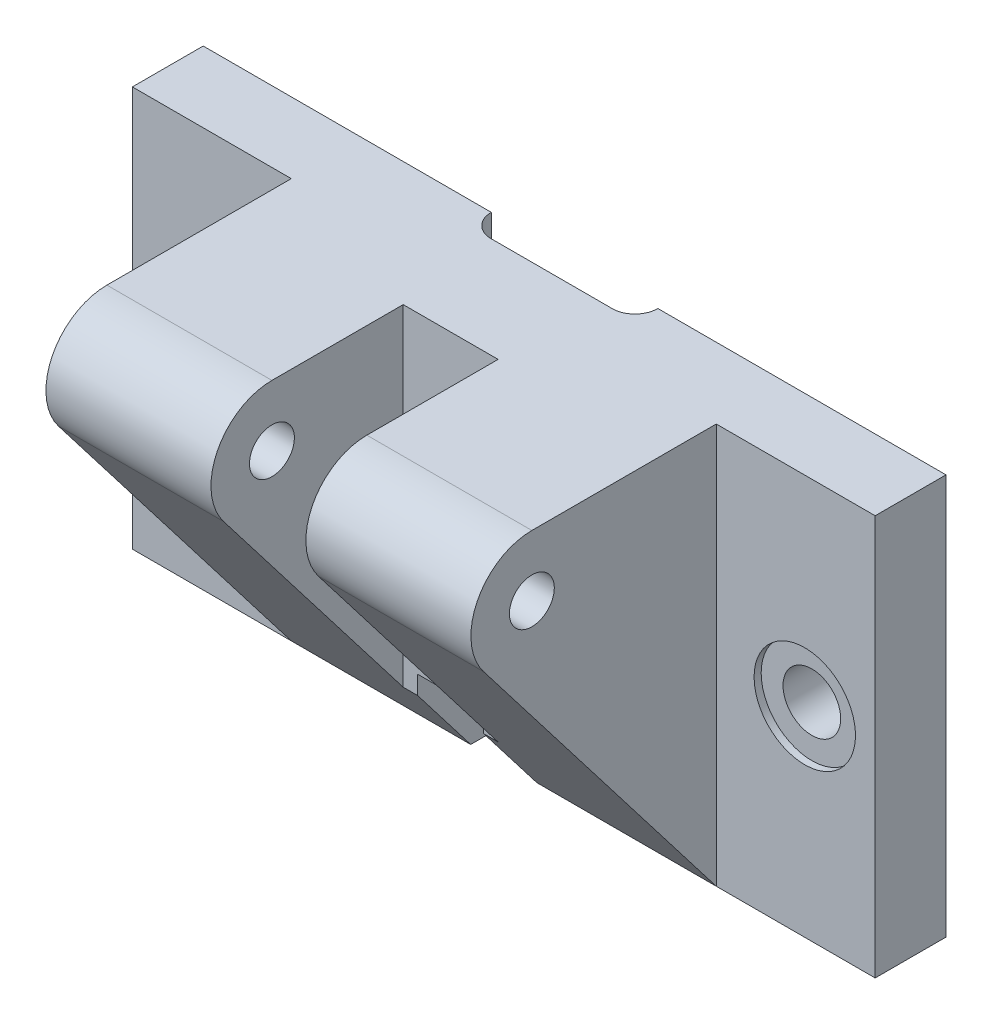
ISO-10303-21;
HEADER;
FILE_DESCRIPTION(('STEP AP214'),'2;1');
FILE_NAME('part.step','',(''),(''),'','','');
FILE_SCHEMA(('AUTOMOTIVE_DESIGN { 1 0 10303 214 1 1 1 1 }'));
ENDSEC;
DATA;
#1=APPLICATION_CONTEXT('core data for automotive mechanical design processes');
#2=APPLICATION_PROTOCOL_DEFINITION('international standard','automotive_design',2000,#1);
#3=PRODUCT_CONTEXT('',#1,'mechanical');
#4=PRODUCT('Part','Part','',(#3));
#5=PRODUCT_RELATED_PRODUCT_CATEGORY('part','',(#4));
#6=PRODUCT_DEFINITION_FORMATION('','',#4);
#7=PRODUCT_DEFINITION_CONTEXT('part definition',#1,'design');
#8=PRODUCT_DEFINITION('design','',#6,#7);
#9=PRODUCT_DEFINITION_SHAPE('','',#8);
#10=(LENGTH_UNIT() NAMED_UNIT(*) SI_UNIT(.MILLI.,.METRE.));
#11=(NAMED_UNIT(*) PLANE_ANGLE_UNIT() SI_UNIT($,.RADIAN.));
#12=(NAMED_UNIT(*) SI_UNIT($,.STERADIAN.) SOLID_ANGLE_UNIT());
#13=UNCERTAINTY_MEASURE_WITH_UNIT(LENGTH_MEASURE(1.E-05),#10,'distance_accuracy_value','');
#14=(GEOMETRIC_REPRESENTATION_CONTEXT(3) GLOBAL_UNCERTAINTY_ASSIGNED_CONTEXT((#13)) GLOBAL_UNIT_ASSIGNED_CONTEXT((#10,
#11,#12)) REPRESENTATION_CONTEXT('',''));
#15=CARTESIAN_POINT('',(0.,0.,0.));
#16=DIRECTION('',(0.,0.,1.));
#17=DIRECTION('',(1.,0.,0.));
#18=AXIS2_PLACEMENT_3D('',#15,#16,#17);
#19=CARTESIAN_POINT('',(60.,35.2757010099702,85.7035733266576));
#20=DIRECTION('',(0.,0.6100561092339,-0.792358216709081));
#21=DIRECTION('',(0.,0.792358216709081,0.6100561092339));
#22=AXIS2_PLACEMENT_3D('',#19,#20,#21);
#23=PLANE('',#22);
#24=DIRECTION('',(-1.,0.,0.));
#25=VECTOR('',#24,1.);
#26=CARTESIAN_POINT('',(60.,-30.5795413747676,35.));
#27=LINE('',#26,#25);
#28=CARTESIAN_POINT('',(13.4007728166381,-30.5795413747676,35.));
#29=VERTEX_POINT('',#28);
#30=CARTESIAN_POINT('',(9.33829474696551,-30.5795413747676,35.));
#31=VERTEX_POINT('',#30);
#32=EDGE_CURVE('E43',#29,#31,#27,.T.);
#33=ORIENTED_EDGE('',*,*,#32,.T.);
#34=DIRECTION('',(0.,-0.792358216709081,-0.6100561092339));
#35=VECTOR('',#34,1.);
#36=CARTESIAN_POINT('',(9.33829474696549,35.2757010099702,85.7035733266576));
#37=LINE('',#36,#35);
#38=CARTESIAN_POINT('',(9.33829474696551,-50.0619677790564,20.));
#39=VERTEX_POINT('',#38);
#40=EDGE_CURVE('E211',#31,#39,#37,.T.);
#41=ORIENTED_EDGE('',*,*,#40,.T.);
#42=DIRECTION('',(-1.,0.,0.));
#43=VECTOR('',#42,1.);
#44=CARTESIAN_POINT('',(60.,-50.0619677790564,20.));
#45=LINE('',#44,#43);
#46=CARTESIAN_POINT('',(60.,-50.0619677790564,20.));
#47=VERTEX_POINT('',#46);
#48=EDGE_CURVE('E266',#47,#39,#45,.T.);
#49=ORIENTED_EDGE('',*,*,#48,.F.);
#50=DIRECTION('',(0.,-0.792358216709081,-0.6100561092339));
#51=VECTOR('',#50,1.);
#52=CARTESIAN_POINT('',(60.,35.2757010099702,85.7035733266576));
#53=LINE('',#52,#51);
#54=CARTESIAN_POINT('',(60.,35.2757010099702,85.7035733266576));
#55=VERTEX_POINT('',#54);
#56=EDGE_CURVE('E262',#55,#47,#53,.T.);
#57=ORIENTED_EDGE('',*,*,#56,.F.);
#58=DIRECTION('',(-1.,0.,0.));
#59=VECTOR('',#58,1.);
#60=CARTESIAN_POINT('',(60.,35.2757010099702,85.7035733266576));
#61=LINE('',#60,#59);
#62=CARTESIAN_POINT('',(13.4007728166381,35.2757010099702,85.7035733266576));
#63=VERTEX_POINT('',#62);
#64=EDGE_CURVE('E270',#55,#63,#61,.T.);
#65=ORIENTED_EDGE('',*,*,#64,.T.);
#66=DIRECTION('',(0.,0.792358216709081,0.6100561092339));
#67=VECTOR('',#66,1.);
#68=CARTESIAN_POINT('',(13.4007728166381,35.2757010099702,85.7035733266576));
#69=LINE('',#68,#67);
#70=EDGE_CURVE('E227',#29,#63,#69,.T.);
#71=ORIENTED_EDGE('',*,*,#70,.F.);
#72=EDGE_LOOP('',(#33,#41,#49,#57,#65,#71));
#73=FACE_BOUND('',#72,.T.);
#74=ADVANCED_FACE('F35',(#73),#23,.F.);
#75=CARTESIAN_POINT('',(0.,-50.0619677790564,20.));
#76=DIRECTION('',(0.,1.,0.));
#77=DIRECTION('',(0.,0.,1.));
#78=AXIS2_PLACEMENT_3D('',#75,#76,#77);
#79=PLANE('',#78);
#80=ORIENTED_EDGE('',*,*,#48,.T.);
#81=DIRECTION('',(0.,0.,-1.));
#82=VECTOR('',#81,1.);
#83=CARTESIAN_POINT('',(9.33829474696551,-50.0619677790564,20.));
#84=LINE('',#83,#82);
#85=CARTESIAN_POINT('',(9.33829474696552,-50.0619677790564,6.46778015199463));
#86=VERTEX_POINT('',#85);
#87=EDGE_CURVE('E208',#39,#86,#84,.T.);
#88=ORIENTED_EDGE('',*,*,#87,.T.);
#89=DIRECTION('',(1.,0.,0.));
#90=VECTOR('',#89,1.);
#91=CARTESIAN_POINT('',(0.,-50.0619677790564,6.46778015199463));
#92=LINE('',#91,#90);
#93=CARTESIAN_POINT('',(16.4915756808324,-50.0619677790564,6.46778015199463));
#94=VERTEX_POINT('',#93);
#95=EDGE_CURVE('E351',#86,#94,#92,.T.);
#96=ORIENTED_EDGE('',*,*,#95,.T.);
#97=CARTESIAN_POINT('',(17.0418961071945,-50.0619677790564,0.));
#98=DIRECTION('',(0.,1.,0.));
#99=DIRECTION('',(0.,0.,1.));
#100=AXIS2_PLACEMENT_3D('',#97,#98,#99);
#101=CIRCLE('',#100,6.49115033458686);
#102=CARTESIAN_POINT('',(23.5330464417814,-50.0619677790564,0.));
#103=VERTEX_POINT('',#102);
#104=EDGE_CURVE('E359',#94,#103,#101,.T.);
#105=ORIENTED_EDGE('',*,*,#104,.T.);
#106=DIRECTION('',(1.,0.,0.));
#107=VECTOR('',#106,1.);
#108=CARTESIAN_POINT('',(0.,-50.0619677790564,0.));
#109=LINE('',#108,#107);
#110=CARTESIAN_POINT('',(104.872117298541,-50.0619677790564,0.));
#111=VERTEX_POINT('',#110);
#112=EDGE_CURVE('E342',#103,#111,#109,.T.);
#113=ORIENTED_EDGE('',*,*,#112,.T.);
#114=DIRECTION('',(0.,0.,-1.));
#115=VECTOR('',#114,1.);
#116=CARTESIAN_POINT('',(104.872117298541,-50.0619677790564,20.));
#117=LINE('',#116,#115);
#118=CARTESIAN_POINT('',(104.872117298541,-50.0619677790564,20.));
#119=VERTEX_POINT('',#118);
#120=EDGE_CURVE('E313',#119,#111,#117,.T.);
#121=ORIENTED_EDGE('',*,*,#120,.F.);
#122=DIRECTION('',(1.,0.,0.));
#123=VECTOR('',#122,1.);
#124=CARTESIAN_POINT('',(0.,-50.0619677790564,20.));
#125=LINE('',#124,#123);
#126=EDGE_CURVE('E332',#47,#119,#125,.T.);
#127=ORIENTED_EDGE('',*,*,#126,.F.);
#128=EDGE_LOOP('',(#80,#88,#96,#105,#113,#121,#127));
#129=FACE_BOUND('',#128,.T.);
#130=ADVANCED_FACE('F399',(#129),#79,.F.);
#131=CARTESIAN_POINT('',(0.,62.9811852704258,20.));
#132=DIRECTION('',(0.,-1.,0.));
#133=DIRECTION('',(0.,0.,-1.));
#134=AXIS2_PLACEMENT_3D('',#131,#132,#133);
#135=PLANE('',#134);
#136=DIRECTION('',(0.,0.,-1.));
#137=VECTOR('',#136,1.);
#138=CARTESIAN_POINT('',(-13.4007728166381,62.9811852704258,134.));
#139=LINE('',#138,#137);
#140=CARTESIAN_POINT('',(-13.4007728166381,62.9811852704258,72.0688509242677));
#141=VERTEX_POINT('',#140);
#142=CARTESIAN_POINT('',(-13.4007728166381,62.9811852704258,35.));
#143=VERTEX_POINT('',#142);
#144=EDGE_CURVE('E221',#141,#143,#139,.T.);
#145=ORIENTED_EDGE('',*,*,#144,.T.);
#146=DIRECTION('',(-1.,0.,0.));
#147=VECTOR('',#146,1.);
#148=CARTESIAN_POINT('',(-13.4007728166381,62.9811852704258,35.));
#149=LINE('',#148,#147);
#150=CARTESIAN_POINT('',(13.4007728166381,62.9811852704258,35.));
#151=VERTEX_POINT('',#150);
#152=EDGE_CURVE('E219',#151,#143,#149,.T.);
#153=ORIENTED_EDGE('',*,*,#152,.F.);
#154=DIRECTION('',(0.,0.,-1.));
#155=VECTOR('',#154,1.);
#156=CARTESIAN_POINT('',(13.4007728166381,62.9811852704258,134.));
#157=LINE('',#156,#155);
#158=CARTESIAN_POINT('',(13.4007728166381,62.9811852704258,72.0688509242677));
#159=VERTEX_POINT('',#158);
#160=EDGE_CURVE('E224',#159,#151,#157,.T.);
#161=ORIENTED_EDGE('',*,*,#160,.F.);
#162=DIRECTION('',(-1.,0.,0.));
#163=VECTOR('',#162,1.);
#164=CARTESIAN_POINT('',(60.,62.9811852704258,72.0688509242677));
#165=LINE('',#164,#163);
#166=CARTESIAN_POINT('',(60.,62.9811852704258,72.0688509242677));
#167=VERTEX_POINT('',#166);
#168=EDGE_CURVE('E274',#167,#159,#165,.T.);
#169=ORIENTED_EDGE('',*,*,#168,.F.);
#170=DIRECTION('',(0.,0.,1.));
#171=VECTOR('',#170,1.);
#172=CARTESIAN_POINT('',(60.,62.9811852704258,20.));
#173=LINE('',#172,#171);
#174=CARTESIAN_POINT('',(60.,62.9811852704258,20.));
#175=VERTEX_POINT('',#174);
#176=EDGE_CURVE('E258',#175,#167,#173,.T.);
#177=ORIENTED_EDGE('',*,*,#176,.F.);
#178=DIRECTION('',(-1.,0.,0.));
#179=VECTOR('',#178,1.);
#180=CARTESIAN_POINT('',(0.,62.9811852704258,20.));
#181=LINE('',#180,#179);
#182=CARTESIAN_POINT('',(104.872117298541,62.9811852704258,20.));
#183=VERTEX_POINT('',#182);
#184=EDGE_CURVE('E327',#183,#175,#181,.T.);
#185=ORIENTED_EDGE('',*,*,#184,.F.);
#186=DIRECTION('',(0.,0.,-1.));
#187=VECTOR('',#186,1.);
#188=CARTESIAN_POINT('',(104.872117298541,62.9811852704258,20.));
#189=LINE('',#188,#187);
#190=CARTESIAN_POINT('',(104.872117298541,62.9811852704258,0.));
#191=VERTEX_POINT('',#190);
#192=EDGE_CURVE('E308',#183,#191,#189,.T.);
#193=ORIENTED_EDGE('',*,*,#192,.T.);
#194=DIRECTION('',(-1.,0.,0.));
#195=VECTOR('',#194,1.);
#196=CARTESIAN_POINT('',(0.,62.9811852704258,0.));
#197=LINE('',#196,#195);
#198=CARTESIAN_POINT('',(23.5330464417814,62.9811852704258,0.));
#199=VERTEX_POINT('',#198);
#200=EDGE_CURVE('E337',#191,#199,#197,.T.);
#201=ORIENTED_EDGE('',*,*,#200,.T.);
#202=CARTESIAN_POINT('',(17.0418961071945,62.9811852704258,0.));
#203=DIRECTION('',(0.,1.,0.));
#204=DIRECTION('',(0.,0.,-1.));
#205=AXIS2_PLACEMENT_3D('',#202,#203,#204);
#206=CIRCLE('',#205,6.49115033458686);
#207=CARTESIAN_POINT('',(16.4915756808324,62.9811852704258,6.46778015199463));
#208=VERTEX_POINT('',#207);
#209=EDGE_CURVE('E283',#208,#199,#206,.T.);
#210=ORIENTED_EDGE('',*,*,#209,.F.);
#211=DIRECTION('',(1.,0.,0.));
#212=VECTOR('',#211,1.);
#213=CARTESIAN_POINT('',(-16.4915756808324,62.9811852704258,6.46778015199463));
#214=LINE('',#213,#212);
#215=CARTESIAN_POINT('',(-16.4915756808324,62.9811852704258,6.46778015199463));
#216=VERTEX_POINT('',#215);
#217=EDGE_CURVE('E280',#216,#208,#214,.T.);
#218=ORIENTED_EDGE('',*,*,#217,.F.);
#219=CARTESIAN_POINT('',(-17.0418961071945,62.9811852704258,0.));
#220=DIRECTION('',(0.,1.,0.));
#221=DIRECTION('',(0.,0.,1.));
#222=AXIS2_PLACEMENT_3D('',#219,#220,#221);
#223=CIRCLE('',#222,6.49115033458686);
#224=CARTESIAN_POINT('',(-23.5330464417814,62.9811852704258,0.));
#225=VERTEX_POINT('',#224);
#226=EDGE_CURVE('E277',#225,#216,#223,.T.);
#227=ORIENTED_EDGE('',*,*,#226,.F.);
#228=CARTESIAN_POINT('',(-104.872117298541,62.9811852704258,0.));
#229=VERTEX_POINT('',#228);
#230=EDGE_CURVE('E326',#225,#229,#197,.T.);
#231=ORIENTED_EDGE('',*,*,#230,.T.);
#232=DIRECTION('',(0.,0.,-1.));
#233=VECTOR('',#232,1.);
#234=CARTESIAN_POINT('',(-104.872117298541,62.9811852704258,20.));
#235=LINE('',#234,#233);
#236=CARTESIAN_POINT('',(-104.872117298541,62.9811852704258,20.));
#237=VERTEX_POINT('',#236);
#238=EDGE_CURVE('E348',#237,#229,#235,.T.);
#239=ORIENTED_EDGE('',*,*,#238,.F.);
#240=CARTESIAN_POINT('',(-60.,62.9811852704258,20.));
#241=VERTEX_POINT('',#240);
#242=EDGE_CURVE('E330',#241,#237,#181,.T.);
#243=ORIENTED_EDGE('',*,*,#242,.F.);
#244=DIRECTION('',(0.,0.,1.));
#245=VECTOR('',#244,1.);
#246=CARTESIAN_POINT('',(-60.,62.9811852704258,20.));
#247=LINE('',#246,#245);
#248=CARTESIAN_POINT('',(-60.,62.9811852704258,72.0688509242677));
#249=VERTEX_POINT('',#248);
#250=EDGE_CURVE('E249',#241,#249,#247,.T.);
#251=ORIENTED_EDGE('',*,*,#250,.T.);
#252=EDGE_CURVE('E273',#141,#249,#165,.T.);
#253=ORIENTED_EDGE('',*,*,#252,.F.);
#254=EDGE_LOOP('',(#145,#153,#161,#169,#177,#185,#193,#201,#210,#218,#227,#231,#239,#243,#251,#253));
#255=FACE_BOUND('',#254,.T.);
#256=ADVANCED_FACE('F37',(#255),#135,.F.);
#257=CARTESIAN_POINT('',(60.,45.7734096521969,72.0688509242677));
#258=DIRECTION('',(-1.,0.,0.));
#259=DIRECTION('',(0.,0.,1.));
#260=AXIS2_PLACEMENT_3D('',#257,#258,#259);
#261=CYLINDRICAL_SURFACE('',#260,17.2077756182289);
#262=CARTESIAN_POINT('',(-13.4007728166381,45.7734096521969,72.0688509242677));
#263=DIRECTION('',(1.,0.,0.));
#264=DIRECTION('',(0.,1.,0.));
#265=AXIS2_PLACEMENT_3D('',#262,#263,#264);
#266=CIRCLE('',#265,17.2077756182289);
#267=CARTESIAN_POINT('',(-13.4007728166381,35.2757010099702,85.7035733266576));
#268=VERTEX_POINT('',#267);
#269=EDGE_CURVE('E235',#141,#268,#266,.T.);
#270=ORIENTED_EDGE('',*,*,#269,.F.);
#271=ORIENTED_EDGE('',*,*,#252,.T.);
#272=CARTESIAN_POINT('',(-60.,45.7734096521969,72.0688509242677));
#273=DIRECTION('',(1.,0.,0.));
#274=DIRECTION('',(0.,0.,-1.));
#275=AXIS2_PLACEMENT_3D('',#272,#273,#274);
#276=CIRCLE('',#275,17.2077756182289);
#277=CARTESIAN_POINT('',(-60.,35.2757010099702,85.7035733266576));
#278=VERTEX_POINT('',#277);
#279=EDGE_CURVE('E246',#249,#278,#276,.T.);
#280=ORIENTED_EDGE('',*,*,#279,.T.);
#281=EDGE_CURVE('E269',#268,#278,#61,.T.);
#282=ORIENTED_EDGE('',*,*,#281,.F.);
#283=EDGE_LOOP('',(#270,#271,#280,#282));
#284=FACE_BOUND('',#283,.T.);
#285=ADVANCED_FACE('F445',(#284),#261,.T.);
#286=CARTESIAN_POINT('',(13.4007728166381,45.7734096521969,72.0688509242677));
#287=DIRECTION('',(-1.,0.,0.));
#288=DIRECTION('',(0.,-1.,0.));
#289=AXIS2_PLACEMENT_3D('',#286,#287,#288);
#290=CIRCLE('',#289,17.2077756182289);
#291=EDGE_CURVE('E229',#63,#159,#290,.T.);
#292=ORIENTED_EDGE('',*,*,#291,.F.);
#293=ORIENTED_EDGE('',*,*,#64,.F.);
#294=CARTESIAN_POINT('',(60.,45.7734096521969,72.0688509242677));
#295=DIRECTION('',(1.,0.,0.));
#296=DIRECTION('',(0.,0.,-1.));
#297=AXIS2_PLACEMENT_3D('',#294,#295,#296);
#298=CIRCLE('',#297,17.2077756182289);
#299=EDGE_CURVE('E260',#167,#55,#298,.T.);
#300=ORIENTED_EDGE('',*,*,#299,.F.);
#301=ORIENTED_EDGE('',*,*,#168,.T.);
#302=EDGE_LOOP('',(#292,#293,#300,#301));
#303=FACE_BOUND('',#302,.T.);
#304=ADVANCED_FACE('F383',(#303),#261,.T.);
#305=CARTESIAN_POINT('',(-9.33829474696551,-50.0619677790564,20.));
#306=VERTEX_POINT('',#305);
#307=CARTESIAN_POINT('',(-60.,-50.0619677790564,20.));
#308=VERTEX_POINT('',#307);
#309=EDGE_CURVE('E265',#306,#308,#45,.T.);
#310=ORIENTED_EDGE('',*,*,#309,.F.);
#311=DIRECTION('',(0.,0.792358216709081,0.6100561092339));
#312=VECTOR('',#311,1.);
#313=CARTESIAN_POINT('',(-9.33829474696551,35.2757010099702,85.7035733266576));
#314=LINE('',#313,#312);
#315=CARTESIAN_POINT('',(-9.33829474696551,-30.5795413747676,35.));
#316=VERTEX_POINT('',#315);
#317=EDGE_CURVE('E203',#306,#316,#314,.T.);
#318=ORIENTED_EDGE('',*,*,#317,.T.);
#319=CARTESIAN_POINT('',(-13.4007728166381,-30.5795413747676,35.));
#320=VERTEX_POINT('',#319);
#321=EDGE_CURVE('E58',#316,#320,#27,.T.);
#322=ORIENTED_EDGE('',*,*,#321,.T.);
#323=DIRECTION('',(0.,-0.792358216709081,-0.6100561092339));
#324=VECTOR('',#323,1.);
#325=CARTESIAN_POINT('',(-13.4007728166381,35.2757010099702,85.7035733266576));
#326=LINE('',#325,#324);
#327=EDGE_CURVE('E232',#268,#320,#326,.T.);
#328=ORIENTED_EDGE('',*,*,#327,.F.);
#329=ORIENTED_EDGE('',*,*,#281,.T.);
#330=DIRECTION('',(0.,-0.792358216709081,-0.6100561092339));
#331=VECTOR('',#330,1.);
#332=CARTESIAN_POINT('',(-60.,35.2757010099702,85.7035733266576));
#333=LINE('',#332,#331);
#334=EDGE_CURVE('E243',#278,#308,#333,.T.);
#335=ORIENTED_EDGE('',*,*,#334,.T.);
#336=EDGE_LOOP('',(#310,#318,#322,#328,#329,#335));
#337=FACE_BOUND('',#336,.T.);
#338=ADVANCED_FACE('F449',(#337),#23,.F.);
#339=CARTESIAN_POINT('',(60.,45.7734096521969,72.0688509242677));
#340=DIRECTION('',(-1.,0.,0.));
#341=DIRECTION('',(0.,0.,1.));
#342=AXIS2_PLACEMENT_3D('',#339,#340,#341);
#343=CYLINDRICAL_SURFACE('',#342,6.34096602010605);
#344=CARTESIAN_POINT('',(-60.,45.7734096521969,72.0688509242677));
#345=DIRECTION('',(1.,0.,0.));
#346=DIRECTION('',(0.,0.,-1.));
#347=AXIS2_PLACEMENT_3D('',#344,#345,#346);
#348=CIRCLE('',#347,6.34096602010605);
#349=CARTESIAN_POINT('',(-60.,45.7734096521969,65.7278849041617));
#350=VERTEX_POINT('',#349);
#351=EDGE_CURVE('E237',#350,#350,#348,.T.);
#352=ORIENTED_EDGE('',*,*,#351,.F.);
#353=EDGE_LOOP('',(#352));
#354=FACE_BOUND('',#353,.T.);
#355=CARTESIAN_POINT('',(-13.4007728166381,45.7734096521969,72.0688509242677));
#356=DIRECTION('',(1.,0.,0.));
#357=DIRECTION('',(0.,1.,0.));
#358=AXIS2_PLACEMENT_3D('',#355,#356,#357);
#359=CIRCLE('',#358,6.34096602010605);
#360=CARTESIAN_POINT('',(-13.4007728166381,52.1143756723029,72.0688509242677));
#361=VERTEX_POINT('',#360);
#362=EDGE_CURVE('E231',#361,#361,#359,.T.);
#363=ORIENTED_EDGE('',*,*,#362,.T.);
#364=EDGE_LOOP('',(#363));
#365=FACE_BOUND('',#364,.T.);
#366=ADVANCED_FACE('F472',(#354,#365),#343,.F.);
#367=CARTESIAN_POINT('',(60.,45.7734096521969,72.0688509242677));
#368=DIRECTION('',(1.,0.,0.));
#369=DIRECTION('',(0.,0.,-1.));
#370=AXIS2_PLACEMENT_3D('',#367,#368,#369);
#371=CIRCLE('',#370,6.34096602010605);
#372=CARTESIAN_POINT('',(60.,45.7734096521969,65.7278849041617));
#373=VERTEX_POINT('',#372);
#374=EDGE_CURVE('E252',#373,#373,#371,.T.);
#375=ORIENTED_EDGE('',*,*,#374,.T.);
#376=EDGE_LOOP('',(#375));
#377=FACE_BOUND('',#376,.T.);
#378=CARTESIAN_POINT('',(13.4007728166381,45.7734096521969,72.0688509242677));
#379=DIRECTION('',(-1.,0.,0.));
#380=DIRECTION('',(0.,-1.,0.));
#381=AXIS2_PLACEMENT_3D('',#378,#379,#380);
#382=CIRCLE('',#381,6.34096602010605);
#383=CARTESIAN_POINT('',(13.4007728166381,39.4324436320908,72.0688509242677));
#384=VERTEX_POINT('',#383);
#385=EDGE_CURVE('E226',#384,#384,#382,.T.);
#386=ORIENTED_EDGE('',*,*,#385,.T.);
#387=EDGE_LOOP('',(#386));
#388=FACE_BOUND('',#387,.T.);
#389=ADVANCED_FACE('F477',(#377,#388),#343,.F.);
#390=CARTESIAN_POINT('',(0.,0.,20.));
#391=DIRECTION('',(0.,0.,-1.));
#392=DIRECTION('',(-1.,0.,0.));
#393=AXIS2_PLACEMENT_3D('',#390,#391,#392);
#394=PLANE('',#393);
#395=CARTESIAN_POINT('',(84.99639808105,6.45960874568469,20.));
#396=DIRECTION('',(0.,0.,-1.));
#397=DIRECTION('',(-1.,0.,0.));
#398=AXIS2_PLACEMENT_3D('',#395,#396,#397);
#399=CIRCLE('',#398,14.3159124161193);
#400=CARTESIAN_POINT('',(70.6804856649307,6.45960874568469,20.));
#401=VERTEX_POINT('',#400);
#402=EDGE_CURVE('E288',#401,#401,#399,.T.);
#403=ORIENTED_EDGE('',*,*,#402,.T.);
#404=EDGE_LOOP('',(#403));
#405=FACE_BOUND('',#404,.T.);
#406=DIRECTION('',(0.,1.,0.));
#407=VECTOR('',#406,1.);
#408=CARTESIAN_POINT('',(60.,62.9811852704258,20.));
#409=LINE('',#408,#407);
#410=EDGE_CURVE('E255',#47,#175,#409,.T.);
#411=ORIENTED_EDGE('',*,*,#410,.F.);
#412=ORIENTED_EDGE('',*,*,#126,.T.);
#413=DIRECTION('',(0.,-1.,0.));
#414=VECTOR('',#413,1.);
#415=CARTESIAN_POINT('',(104.872117298541,62.9811852704258,20.));
#416=LINE('',#415,#414);
#417=EDGE_CURVE('E305',#183,#119,#416,.T.);
#418=ORIENTED_EDGE('',*,*,#417,.F.);
#419=ORIENTED_EDGE('',*,*,#184,.T.);
#420=EDGE_LOOP('',(#411,#412,#418,#419));
#421=FACE_BOUND('',#420,.T.);
#422=ADVANCED_FACE('F395',(#405,#421),#394,.F.);
#423=CARTESIAN_POINT('',(0.,0.,0.));
#424=DIRECTION('',(0.,0.,-1.));
#425=DIRECTION('',(-1.,0.,0.));
#426=AXIS2_PLACEMENT_3D('',#423,#424,#425);
#427=PLANE('',#426);
#428=DIRECTION('',(0.,1.,0.));
#429=VECTOR('',#428,1.);
#430=CARTESIAN_POINT('',(-23.5330464417814,-77.0188147295742,0.));
#431=LINE('',#430,#429);
#432=CARTESIAN_POINT('',(-23.5330464417814,-50.0619677790564,0.));
#433=VERTEX_POINT('',#432);
#434=EDGE_CURVE('E286',#433,#225,#431,.T.);
#435=ORIENTED_EDGE('',*,*,#434,.F.);
#436=CARTESIAN_POINT('',(-104.872117298541,-50.0619677790564,0.));
#437=VERTEX_POINT('',#436);
#438=EDGE_CURVE('E343',#437,#433,#109,.T.);
#439=ORIENTED_EDGE('',*,*,#438,.F.);
#440=DIRECTION('',(0.,-1.,0.));
#441=VECTOR('',#440,1.);
#442=CARTESIAN_POINT('',(-104.872117298541,62.9811852704258,0.));
#443=LINE('',#442,#441);
#444=EDGE_CURVE('E340',#229,#437,#443,.T.);
#445=ORIENTED_EDGE('',*,*,#444,.F.);
#446=ORIENTED_EDGE('',*,*,#230,.F.);
#447=EDGE_LOOP('',(#435,#439,#445,#446));
#448=FACE_BOUND('',#447,.T.);
#449=CARTESIAN_POINT('',(-84.99639808105,6.45960874568469,0.));
#450=DIRECTION('',(0.,0.,1.));
#451=DIRECTION('',(1.,0.,0.));
#452=AXIS2_PLACEMENT_3D('',#449,#450,#451);
#453=CIRCLE('',#452,8.13922987678997);
#454=CARTESIAN_POINT('',(-76.85716820426,6.45960874568469,0.));
#455=VERTEX_POINT('',#454);
#456=EDGE_CURVE('E323',#455,#455,#453,.T.);
#457=ORIENTED_EDGE('',*,*,#456,.T.);
#458=EDGE_LOOP('',(#457));
#459=FACE_BOUND('',#458,.T.);
#460=ADVANCED_FACE('F422',(#448,#459),#427,.T.);
#461=CARTESIAN_POINT('',(84.99639808105,6.45960874568469,20.));
#462=DIRECTION('',(0.,0.,-1.));
#463=DIRECTION('',(-1.,0.,0.));
#464=AXIS2_PLACEMENT_3D('',#461,#462,#463);
#465=CYLINDRICAL_SURFACE('',#464,8.13922987678997);
#466=CARTESIAN_POINT('',(84.99639808105,6.45960874568469,0.));
#467=DIRECTION('',(0.,0.,-1.));
#468=DIRECTION('',(-1.,0.,0.));
#469=AXIS2_PLACEMENT_3D('',#466,#467,#468);
#470=CIRCLE('',#469,8.13922987678997);
#471=CARTESIAN_POINT('',(76.85716820426,6.45960874568469,0.));
#472=VERTEX_POINT('',#471);
#473=EDGE_CURVE('E301',#472,#472,#470,.T.);
#474=ORIENTED_EDGE('',*,*,#473,.T.);
#475=EDGE_LOOP('',(#474));
#476=FACE_BOUND('',#475,.T.);
#477=CARTESIAN_POINT('',(84.99639808105,6.45960874568469,18.));
#478=DIRECTION('',(0.,0.,1.));
#479=DIRECTION('',(1.,0.,0.));
#480=AXIS2_PLACEMENT_3D('',#477,#478,#479);
#481=CIRCLE('',#480,8.13922987678997);
#482=CARTESIAN_POINT('',(93.1356279578399,6.45960874568469,18.));
#483=VERTEX_POINT('',#482);
#484=EDGE_CURVE('E298',#483,#483,#481,.F.);
#485=ORIENTED_EDGE('',*,*,#484,.F.);
#486=EDGE_LOOP('',(#485));
#487=FACE_BOUND('',#486,.T.);
#488=ADVANCED_FACE('F498',(#476,#487),#465,.F.);
#489=CARTESIAN_POINT('',(-84.99639808105,6.45960874568469,20.));
#490=DIRECTION('',(0.,0.,-1.));
#491=DIRECTION('',(-1.,0.,0.));
#492=AXIS2_PLACEMENT_3D('',#489,#490,#491);
#493=CYLINDRICAL_SURFACE('',#492,8.13922987678997);
#494=ORIENTED_EDGE('',*,*,#456,.F.);
#495=EDGE_LOOP('',(#494));
#496=FACE_BOUND('',#495,.T.);
#497=CARTESIAN_POINT('',(-84.99639808105,6.45960874568469,18.));
#498=DIRECTION('',(0.,0.,1.));
#499=DIRECTION('',(1.,0.,0.));
#500=AXIS2_PLACEMENT_3D('',#497,#498,#499);
#501=CIRCLE('',#500,8.13922987678997);
#502=CARTESIAN_POINT('',(-76.85716820426,6.45960874568469,18.));
#503=VERTEX_POINT('',#502);
#504=EDGE_CURVE('E320',#503,#503,#501,.T.);
#505=ORIENTED_EDGE('',*,*,#504,.T.);
#506=EDGE_LOOP('',(#505));
#507=FACE_BOUND('',#506,.T.);
#508=ADVANCED_FACE('F501',(#496,#507),#493,.F.);
#509=CARTESIAN_POINT('',(-84.99639808105,6.45960874568469,20.));
#510=DIRECTION('',(0.,0.,1.));
#511=DIRECTION('',(1.,0.,0.));
#512=AXIS2_PLACEMENT_3D('',#509,#510,#511);
#513=CIRCLE('',#512,14.3159124161193);
#514=CARTESIAN_POINT('',(-70.6804856649307,6.45960874568469,20.));
#515=VERTEX_POINT('',#514);
#516=EDGE_CURVE('E316',#515,#515,#513,.T.);
#517=ORIENTED_EDGE('',*,*,#516,.F.);
#518=EDGE_LOOP('',(#517));
#519=FACE_BOUND('',#518,.T.);
#520=CARTESIAN_POINT('',(-104.872117298541,-50.0619677790564,20.));
#521=VERTEX_POINT('',#520);
#522=EDGE_CURVE('E333',#521,#308,#125,.T.);
#523=ORIENTED_EDGE('',*,*,#522,.T.);
#524=DIRECTION('',(0.,1.,0.));
#525=VECTOR('',#524,1.);
#526=CARTESIAN_POINT('',(-60.,62.9811852704258,20.));
#527=LINE('',#526,#525);
#528=EDGE_CURVE('E240',#308,#241,#527,.T.);
#529=ORIENTED_EDGE('',*,*,#528,.T.);
#530=ORIENTED_EDGE('',*,*,#242,.T.);
#531=DIRECTION('',(0.,-1.,0.));
#532=VECTOR('',#531,1.);
#533=CARTESIAN_POINT('',(-104.872117298541,62.9811852704258,20.));
#534=LINE('',#533,#532);
#535=EDGE_CURVE('E329',#237,#521,#534,.T.);
#536=ORIENTED_EDGE('',*,*,#535,.T.);
#537=EDGE_LOOP('',(#523,#529,#530,#536));
#538=FACE_BOUND('',#537,.T.);
#539=ADVANCED_FACE('F435',(#519,#538),#394,.F.);
#540=DIRECTION('',(0.,1.,0.));
#541=VECTOR('',#540,1.);
#542=CARTESIAN_POINT('',(23.5330464417814,-77.0188147295742,0.));
#543=LINE('',#542,#541);
#544=EDGE_CURVE('E289',#103,#199,#543,.T.);
#545=ORIENTED_EDGE('',*,*,#544,.T.);
#546=ORIENTED_EDGE('',*,*,#200,.F.);
#547=DIRECTION('',(0.,-1.,0.));
#548=VECTOR('',#547,1.);
#549=CARTESIAN_POINT('',(104.872117298541,62.9811852704258,0.));
#550=LINE('',#549,#548);
#551=EDGE_CURVE('E304',#191,#111,#550,.T.);
#552=ORIENTED_EDGE('',*,*,#551,.T.);
#553=ORIENTED_EDGE('',*,*,#112,.F.);
#554=EDGE_LOOP('',(#545,#546,#552,#553));
#555=FACE_BOUND('',#554,.T.);
#556=ORIENTED_EDGE('',*,*,#473,.F.);
#557=EDGE_LOOP('',(#556));
#558=FACE_BOUND('',#557,.T.);
#559=ADVANCED_FACE('F402',(#555,#558),#427,.T.);
#560=CARTESIAN_POINT('',(-104.872117298541,62.9811852704258,20.));
#561=DIRECTION('',(1.,0.,0.));
#562=DIRECTION('',(0.,0.,-1.));
#563=AXIS2_PLACEMENT_3D('',#560,#561,#562);
#564=PLANE('',#563);
#565=ORIENTED_EDGE('',*,*,#444,.T.);
#566=DIRECTION('',(0.,0.,-1.));
#567=VECTOR('',#566,1.);
#568=CARTESIAN_POINT('',(-104.872117298541,-50.0619677790564,20.));
#569=LINE('',#568,#567);
#570=EDGE_CURVE('E336',#521,#437,#569,.T.);
#571=ORIENTED_EDGE('',*,*,#570,.F.);
#572=ORIENTED_EDGE('',*,*,#535,.F.);
#573=ORIENTED_EDGE('',*,*,#238,.T.);
#574=EDGE_LOOP('',(#565,#571,#572,#573));
#575=FACE_BOUND('',#574,.T.);
#576=ADVANCED_FACE('F427',(#575),#564,.F.);
#577=CARTESIAN_POINT('',(-16.4915756808324,-50.0619677790564,6.46778015199463));
#578=VERTEX_POINT('',#577);
#579=CARTESIAN_POINT('',(-9.33829474696551,-50.0619677790564,6.46778015199463));
#580=VERTEX_POINT('',#579);
#581=EDGE_CURVE('E356',#578,#580,#92,.T.);
#582=ORIENTED_EDGE('',*,*,#581,.T.);
#583=DIRECTION('',(0.,0.,1.));
#584=VECTOR('',#583,1.);
#585=CARTESIAN_POINT('',(-9.33829474696551,-50.0619677790564,20.));
#586=LINE('',#585,#584);
#587=EDGE_CURVE('E200',#580,#306,#586,.T.);
#588=ORIENTED_EDGE('',*,*,#587,.T.);
#589=ORIENTED_EDGE('',*,*,#309,.T.);
#590=ORIENTED_EDGE('',*,*,#522,.F.);
#591=ORIENTED_EDGE('',*,*,#570,.T.);
#592=ORIENTED_EDGE('',*,*,#438,.T.);
#593=CARTESIAN_POINT('',(-17.0418961071945,-50.0619677790564,0.));
#594=DIRECTION('',(0.,1.,0.));
#595=DIRECTION('',(0.,0.,1.));
#596=AXIS2_PLACEMENT_3D('',#593,#594,#595);
#597=CIRCLE('',#596,6.49115033458686);
#598=EDGE_CURVE('E362',#433,#578,#597,.T.);
#599=ORIENTED_EDGE('',*,*,#598,.T.);
#600=EDGE_LOOP('',(#582,#588,#589,#590,#591,#592,#599));
#601=FACE_BOUND('',#600,.T.);
#602=ADVANCED_FACE('F431',(#601),#79,.F.);
#603=CARTESIAN_POINT('',(-84.99639808105,6.45960874568469,18.));
#604=DIRECTION('',(0.,0.,1.));
#605=DIRECTION('',(1.,0.,0.));
#606=AXIS2_PLACEMENT_3D('',#603,#604,#605);
#607=CYLINDRICAL_SURFACE('',#606,14.3159124161193);
#608=CARTESIAN_POINT('',(-84.99639808105,6.45960874568469,18.));
#609=DIRECTION('',(0.,0.,1.));
#610=DIRECTION('',(1.,0.,0.));
#611=AXIS2_PLACEMENT_3D('',#608,#609,#610);
#612=CIRCLE('',#611,14.3159124161193);
#613=CARTESIAN_POINT('',(-70.6804856649307,6.45960874568469,18.));
#614=VERTEX_POINT('',#613);
#615=EDGE_CURVE('E317',#614,#614,#612,.T.);
#616=ORIENTED_EDGE('',*,*,#615,.F.);
#617=EDGE_LOOP('',(#616));
#618=FACE_BOUND('',#617,.T.);
#619=ORIENTED_EDGE('',*,*,#516,.T.);
#620=EDGE_LOOP('',(#619));
#621=FACE_BOUND('',#620,.T.);
#622=ADVANCED_FACE('F508',(#618,#621),#607,.F.);
#623=CARTESIAN_POINT('',(-84.99639808105,6.45960874568469,18.));
#624=DIRECTION('',(0.,0.,1.));
#625=DIRECTION('',(1.,0.,0.));
#626=AXIS2_PLACEMENT_3D('',#623,#624,#625);
#627=PLANE('',#626);
#628=ORIENTED_EDGE('',*,*,#504,.F.);
#629=EDGE_LOOP('',(#628));
#630=FACE_BOUND('',#629,.T.);
#631=ORIENTED_EDGE('',*,*,#615,.T.);
#632=EDGE_LOOP('',(#631));
#633=FACE_BOUND('',#632,.T.);
#634=ADVANCED_FACE('F505',(#630,#633),#627,.T.);
#635=CARTESIAN_POINT('',(104.872117298541,62.9811852704258,20.));
#636=DIRECTION('',(1.,0.,0.));
#637=DIRECTION('',(0.,0.,-1.));
#638=AXIS2_PLACEMENT_3D('',#635,#636,#637);
#639=PLANE('',#638);
#640=ORIENTED_EDGE('',*,*,#551,.F.);
#641=ORIENTED_EDGE('',*,*,#192,.F.);
#642=ORIENTED_EDGE('',*,*,#417,.T.);
#643=ORIENTED_EDGE('',*,*,#120,.T.);
#644=EDGE_LOOP('',(#640,#641,#642,#643));
#645=FACE_BOUND('',#644,.T.);
#646=ADVANCED_FACE('F394',(#645),#639,.T.);
#647=CARTESIAN_POINT('',(84.99639808105,6.45960874568469,18.));
#648=DIRECTION('',(0.,0.,1.));
#649=DIRECTION('',(-1.,0.,0.));
#650=AXIS2_PLACEMENT_3D('',#647,#648,#649);
#651=PLANE('',#650);
#652=CARTESIAN_POINT('',(84.99639808105,6.45960874568469,18.));
#653=DIRECTION('',(0.,0.,-1.));
#654=DIRECTION('',(-1.,0.,0.));
#655=AXIS2_PLACEMENT_3D('',#652,#653,#654);
#656=CIRCLE('',#655,14.3159124161193);
#657=CARTESIAN_POINT('',(70.6804856649307,6.45960874568469,18.));
#658=VERTEX_POINT('',#657);
#659=EDGE_CURVE('E295',#658,#658,#656,.T.);
#660=ORIENTED_EDGE('',*,*,#659,.F.);
#661=EDGE_LOOP('',(#660));
#662=FACE_BOUND('',#661,.T.);
#663=ORIENTED_EDGE('',*,*,#484,.T.);
#664=EDGE_LOOP('',(#663));
#665=FACE_BOUND('',#664,.T.);
#666=ADVANCED_FACE('F491',(#662,#665),#651,.T.);
#667=CARTESIAN_POINT('',(84.99639808105,6.45960874568469,18.));
#668=DIRECTION('',(0.,0.,1.));
#669=DIRECTION('',(1.,0.,0.));
#670=AXIS2_PLACEMENT_3D('',#667,#668,#669);
#671=CYLINDRICAL_SURFACE('',#670,14.3159124161193);
#672=ORIENTED_EDGE('',*,*,#659,.T.);
#673=EDGE_LOOP('',(#672));
#674=FACE_BOUND('',#673,.T.);
#675=ORIENTED_EDGE('',*,*,#402,.F.);
#676=EDGE_LOOP('',(#675));
#677=FACE_BOUND('',#676,.T.);
#678=ADVANCED_FACE('F490',(#674,#677),#671,.F.);
#679=CARTESIAN_POINT('',(-17.0418961071945,-77.0188147295742,0.));
#680=DIRECTION('',(0.,1.,0.));
#681=DIRECTION('',(0.,0.,1.));
#682=AXIS2_PLACEMENT_3D('',#679,#680,#681);
#683=CYLINDRICAL_SURFACE('',#682,6.49115033458686);
#684=ORIENTED_EDGE('',*,*,#434,.T.);
#685=ORIENTED_EDGE('',*,*,#226,.T.);
#686=DIRECTION('',(0.,1.,0.));
#687=VECTOR('',#686,1.);
#688=CARTESIAN_POINT('',(-16.4915756808324,-77.0188147295742,6.46778015199463));
#689=LINE('',#688,#687);
#690=EDGE_CURVE('E285',#578,#216,#689,.T.);
#691=ORIENTED_EDGE('',*,*,#690,.F.);
#692=ORIENTED_EDGE('',*,*,#598,.F.);
#693=EDGE_LOOP('',(#684,#685,#691,#692));
#694=FACE_BOUND('',#693,.T.);
#695=ADVANCED_FACE('F416',(#694),#683,.F.);
#696=CARTESIAN_POINT('',(17.0418961071945,-77.0188147295742,0.));
#697=DIRECTION('',(0.,1.,0.));
#698=DIRECTION('',(0.,0.,1.));
#699=AXIS2_PLACEMENT_3D('',#696,#697,#698);
#700=CYLINDRICAL_SURFACE('',#699,6.49115033458686);
#701=DIRECTION('',(0.,1.,0.));
#702=VECTOR('',#701,1.);
#703=CARTESIAN_POINT('',(16.4915756808324,-77.0188147295742,6.46778015199463));
#704=LINE('',#703,#702);
#705=EDGE_CURVE('E292',#94,#208,#704,.T.);
#706=ORIENTED_EDGE('',*,*,#705,.T.);
#707=ORIENTED_EDGE('',*,*,#209,.T.);
#708=ORIENTED_EDGE('',*,*,#544,.F.);
#709=ORIENTED_EDGE('',*,*,#104,.F.);
#710=EDGE_LOOP('',(#706,#707,#708,#709));
#711=FACE_BOUND('',#710,.T.);
#712=ADVANCED_FACE('F408',(#711),#700,.F.);
#713=CARTESIAN_POINT('',(-16.4915756808324,-77.0188147295742,6.46778015199463));
#714=DIRECTION('',(0.,0.,1.));
#715=DIRECTION('',(1.,0.,0.));
#716=AXIS2_PLACEMENT_3D('',#713,#714,#715);
#717=PLANE('',#716);
#718=ORIENTED_EDGE('',*,*,#95,.F.);
#719=DIRECTION('',(0.,1.,0.));
#720=VECTOR('',#719,1.);
#721=CARTESIAN_POINT('',(9.33829474696553,-77.0188147295742,6.46778015199463));
#722=LINE('',#721,#720);
#723=CARTESIAN_POINT('',(9.33829474696551,-25.3643167735794,6.46778015199463));
#724=VERTEX_POINT('',#723);
#725=EDGE_CURVE('E205',#86,#724,#722,.T.);
#726=ORIENTED_EDGE('',*,*,#725,.T.);
#727=DIRECTION('',(-1.,0.,0.));
#728=VECTOR('',#727,1.);
#729=CARTESIAN_POINT('',(-16.4915756808324,-25.3643167735795,6.46778015199463));
#730=LINE('',#729,#728);
#731=CARTESIAN_POINT('',(-9.33829474696551,-25.3643167735795,6.46778015199463));
#732=VERTEX_POINT('',#731);
#733=EDGE_CURVE('E187',#724,#732,#730,.T.);
#734=ORIENTED_EDGE('',*,*,#733,.T.);
#735=DIRECTION('',(0.,-1.,0.));
#736=VECTOR('',#735,1.);
#737=CARTESIAN_POINT('',(-9.33829474696551,-77.0188147295742,6.46778015199463));
#738=LINE('',#737,#736);
#739=EDGE_CURVE('E185',#732,#580,#738,.T.);
#740=ORIENTED_EDGE('',*,*,#739,.T.);
#741=ORIENTED_EDGE('',*,*,#581,.F.);
#742=ORIENTED_EDGE('',*,*,#690,.T.);
#743=ORIENTED_EDGE('',*,*,#217,.T.);
#744=ORIENTED_EDGE('',*,*,#705,.F.);
#745=EDGE_LOOP('',(#718,#726,#734,#740,#741,#742,#743,#744));
#746=FACE_BOUND('',#745,.T.);
#747=ADVANCED_FACE('F413',(#746),#717,.F.);
#748=CARTESIAN_POINT('',(60.,45.7734096521969,72.0688509242677));
#749=DIRECTION('',(1.,0.,0.));
#750=DIRECTION('',(0.,0.,-1.));
#751=AXIS2_PLACEMENT_3D('',#748,#749,#750);
#752=PLANE('',#751);
#753=ORIENTED_EDGE('',*,*,#410,.T.);
#754=ORIENTED_EDGE('',*,*,#176,.T.);
#755=ORIENTED_EDGE('',*,*,#299,.T.);
#756=ORIENTED_EDGE('',*,*,#56,.T.);
#757=EDGE_LOOP('',(#753,#754,#755,#756));
#758=FACE_BOUND('',#757,.T.);
#759=ORIENTED_EDGE('',*,*,#374,.F.);
#760=EDGE_LOOP('',(#759));
#761=FACE_BOUND('',#760,.T.);
#762=ADVANCED_FACE('F387',(#758,#761),#752,.T.);
#763=CARTESIAN_POINT('',(-60.,45.7734096521969,72.0688509242677));
#764=DIRECTION('',(-1.,0.,0.));
#765=DIRECTION('',(0.,0.,-1.));
#766=AXIS2_PLACEMENT_3D('',#763,#764,#765);
#767=PLANE('',#766);
#768=ORIENTED_EDGE('',*,*,#351,.T.);
#769=EDGE_LOOP('',(#768));
#770=FACE_BOUND('',#769,.T.);
#771=ORIENTED_EDGE('',*,*,#528,.F.);
#772=ORIENTED_EDGE('',*,*,#334,.F.);
#773=ORIENTED_EDGE('',*,*,#279,.F.);
#774=ORIENTED_EDGE('',*,*,#250,.F.);
#775=EDGE_LOOP('',(#771,#772,#773,#774));
#776=FACE_BOUND('',#775,.T.);
#777=ADVANCED_FACE('F440',(#770,#776),#767,.T.);
#778=CARTESIAN_POINT('',(0.,0.,35.));
#779=DIRECTION('',(0.,0.,-1.));
#780=DIRECTION('',(-1.,0.,0.));
#781=AXIS2_PLACEMENT_3D('',#778,#779,#780);
#782=PLANE('',#781);
#783=DIRECTION('',(-1.,0.,0.));
#784=VECTOR('',#783,1.);
#785=CARTESIAN_POINT('',(9.33829474696551,-25.3643167735794,35.));
#786=LINE('',#785,#784);
#787=CARTESIAN_POINT('',(9.33829474696551,-25.3643167735794,35.));
#788=VERTEX_POINT('',#787);
#789=CARTESIAN_POINT('',(-9.33829474696551,-25.3643167735795,35.));
#790=VERTEX_POINT('',#789);
#791=EDGE_CURVE('E190',#788,#790,#786,.T.);
#792=ORIENTED_EDGE('',*,*,#791,.F.);
#793=DIRECTION('',(0.,-1.,0.));
#794=VECTOR('',#793,1.);
#795=CARTESIAN_POINT('',(9.3382947469655,0.,35.));
#796=LINE('',#795,#794);
#797=EDGE_CURVE('E11',#788,#31,#796,.T.);
#798=ORIENTED_EDGE('',*,*,#797,.T.);
#799=ORIENTED_EDGE('',*,*,#32,.F.);
#800=DIRECTION('',(0.,1.,0.));
#801=VECTOR('',#800,1.);
#802=CARTESIAN_POINT('',(13.4007728166381,62.9811852704258,35.));
#803=LINE('',#802,#801);
#804=EDGE_CURVE('E216',#29,#151,#803,.T.);
#805=ORIENTED_EDGE('',*,*,#804,.T.);
#806=ORIENTED_EDGE('',*,*,#152,.T.);
#807=DIRECTION('',(0.,-1.,0.));
#808=VECTOR('',#807,1.);
#809=CARTESIAN_POINT('',(-13.4007728166381,-50.0619677790564,35.));
#810=LINE('',#809,#808);
#811=EDGE_CURVE('E214',#143,#320,#810,.T.);
#812=ORIENTED_EDGE('',*,*,#811,.T.);
#813=ORIENTED_EDGE('',*,*,#321,.F.);
#814=DIRECTION('',(0.,-1.,0.));
#815=VECTOR('',#814,1.);
#816=CARTESIAN_POINT('',(-9.33829474696551,-68.615366127946,35.));
#817=LINE('',#816,#815);
#818=EDGE_CURVE('E183',#790,#316,#817,.T.);
#819=ORIENTED_EDGE('',*,*,#818,.F.);
#820=EDGE_LOOP('',(#792,#798,#799,#805,#806,#812,#813,#819));
#821=FACE_BOUND('',#820,.T.);
#822=ADVANCED_FACE('F194',(#821),#782,.F.);
#823=CARTESIAN_POINT('',(-13.4007728166381,-50.0619677790564,134.));
#824=DIRECTION('',(1.,0.,0.));
#825=DIRECTION('',(0.,1.,0.));
#826=AXIS2_PLACEMENT_3D('',#823,#824,#825);
#827=PLANE('',#826);
#828=ORIENTED_EDGE('',*,*,#362,.F.);
#829=EDGE_LOOP('',(#828));
#830=FACE_BOUND('',#829,.T.);
#831=ORIENTED_EDGE('',*,*,#269,.T.);
#832=ORIENTED_EDGE('',*,*,#327,.T.);
#833=ORIENTED_EDGE('',*,*,#811,.F.);
#834=ORIENTED_EDGE('',*,*,#144,.F.);
#835=EDGE_LOOP('',(#831,#832,#833,#834));
#836=FACE_BOUND('',#835,.T.);
#837=ADVANCED_FACE('F447',(#830,#836),#827,.T.);
#838=CARTESIAN_POINT('',(13.4007728166381,62.9811852704258,134.));
#839=DIRECTION('',(-1.,0.,0.));
#840=DIRECTION('',(0.,-1.,0.));
#841=AXIS2_PLACEMENT_3D('',#838,#839,#840);
#842=PLANE('',#841);
#843=ORIENTED_EDGE('',*,*,#385,.F.);
#844=EDGE_LOOP('',(#843));
#845=FACE_BOUND('',#844,.T.);
#846=ORIENTED_EDGE('',*,*,#291,.T.);
#847=ORIENTED_EDGE('',*,*,#160,.T.);
#848=ORIENTED_EDGE('',*,*,#804,.F.);
#849=ORIENTED_EDGE('',*,*,#70,.T.);
#850=EDGE_LOOP('',(#846,#847,#848,#849));
#851=FACE_BOUND('',#850,.T.);
#852=ADVANCED_FACE('F375',(#845,#851),#842,.T.);
#853=CARTESIAN_POINT('',(9.33829474696552,-68.615366127946,-50.));
#854=DIRECTION('',(1.,0.,0.));
#855=DIRECTION('',(0.,1.,0.));
#856=AXIS2_PLACEMENT_3D('',#853,#854,#855);
#857=PLANE('',#856);
#858=ORIENTED_EDGE('',*,*,#797,.F.);
#859=DIRECTION('',(0.,0.,1.));
#860=VECTOR('',#859,1.);
#861=CARTESIAN_POINT('',(9.33829474696551,-25.3643167735794,-50.));
#862=LINE('',#861,#860);
#863=EDGE_CURVE('E50',#724,#788,#862,.T.);
#864=ORIENTED_EDGE('',*,*,#863,.F.);
#865=ORIENTED_EDGE('',*,*,#725,.F.);
#866=ORIENTED_EDGE('',*,*,#87,.F.);
#867=ORIENTED_EDGE('',*,*,#40,.F.);
#868=EDGE_LOOP('',(#858,#864,#865,#866,#867));
#869=FACE_BOUND('',#868,.T.);
#870=ADVANCED_FACE('F451',(#869),#857,.F.);
#871=CARTESIAN_POINT('',(-9.33829474696551,-68.615366127946,-50.));
#872=DIRECTION('',(-1.,0.,0.));
#873=DIRECTION('',(0.,0.,1.));
#874=AXIS2_PLACEMENT_3D('',#871,#872,#873);
#875=PLANE('',#874);
#876=ORIENTED_EDGE('',*,*,#587,.F.);
#877=ORIENTED_EDGE('',*,*,#739,.F.);
#878=DIRECTION('',(0.,0.,1.));
#879=VECTOR('',#878,1.);
#880=CARTESIAN_POINT('',(-9.33829474696551,-25.3643167735795,-50.));
#881=LINE('',#880,#879);
#882=EDGE_CURVE('E180',#732,#790,#881,.T.);
#883=ORIENTED_EDGE('',*,*,#882,.T.);
#884=ORIENTED_EDGE('',*,*,#818,.T.);
#885=ORIENTED_EDGE('',*,*,#317,.F.);
#886=EDGE_LOOP('',(#876,#877,#883,#884,#885));
#887=FACE_BOUND('',#886,.T.);
#888=ADVANCED_FACE('F181',(#887),#875,.F.);
#889=CARTESIAN_POINT('',(9.33829474696551,-25.3643167735794,-50.));
#890=DIRECTION('',(0.,1.,0.));
#891=DIRECTION('',(-1.,0.,0.));
#892=AXIS2_PLACEMENT_3D('',#889,#890,#891);
#893=PLANE('',#892);
#894=ORIENTED_EDGE('',*,*,#863,.T.);
#895=ORIENTED_EDGE('',*,*,#791,.T.);
#896=ORIENTED_EDGE('',*,*,#882,.F.);
#897=ORIENTED_EDGE('',*,*,#733,.F.);
#898=EDGE_LOOP('',(#894,#895,#896,#897));
#899=FACE_BOUND('',#898,.T.);
#900=ADVANCED_FACE('F191',(#899),#893,.F.);
#901=CLOSED_SHELL('',(#74,#130,#256,#285,#304,#338,#366,#389,#422,#460,#488,#508,#539,#559,#576,
#602,#622,#634,#646,#666,#678,#695,#712,#747,#762,#777,#822,#837,#852,#870,#888,#900));
#902=MANIFOLD_SOLID_BREP('B2',#901);
#903=ADVANCED_BREP_SHAPE_REPRESENTATION('',(#18,#902),#14);
#904=SHAPE_DEFINITION_REPRESENTATION(#9,#903);
ENDSEC;
END-ISO-10303-21;
